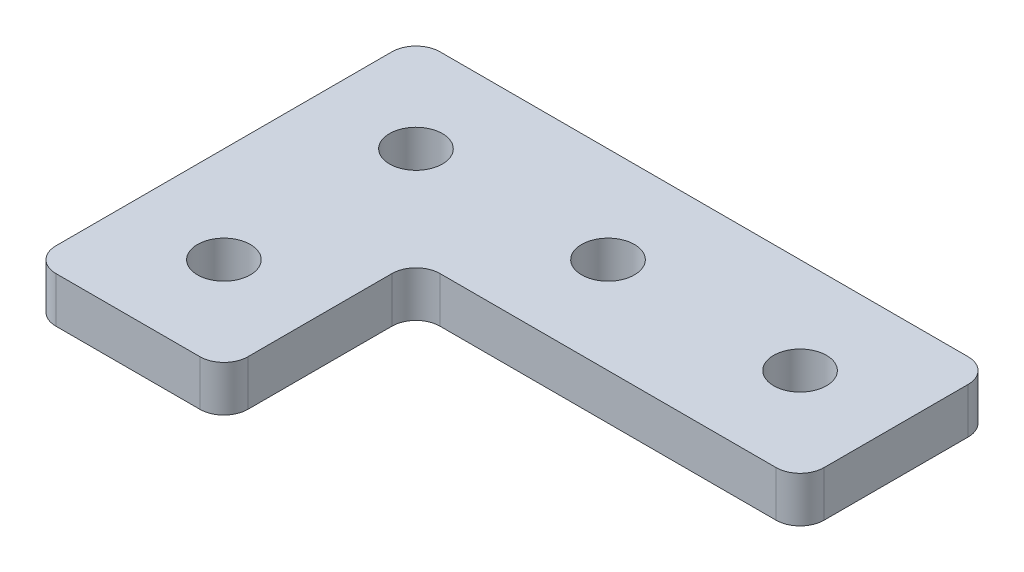
ISO-10303-21;
HEADER;
FILE_DESCRIPTION(('STEP AP214'),'2;1');
FILE_NAME('part.step','',(''),(''),'','','');
FILE_SCHEMA(('AUTOMOTIVE_DESIGN { 1 0 10303 214 1 1 1 1 }'));
ENDSEC;
DATA;
#1=APPLICATION_CONTEXT('core data for automotive mechanical design processes');
#2=APPLICATION_PROTOCOL_DEFINITION('international standard','automotive_design',2000,#1);
#3=PRODUCT_CONTEXT('',#1,'mechanical');
#4=PRODUCT('Part','Part','',(#3));
#5=PRODUCT_RELATED_PRODUCT_CATEGORY('part','',(#4));
#6=PRODUCT_DEFINITION_FORMATION('','',#4);
#7=PRODUCT_DEFINITION_CONTEXT('part definition',#1,'design');
#8=PRODUCT_DEFINITION('design','',#6,#7);
#9=PRODUCT_DEFINITION_SHAPE('','',#8);
#10=(LENGTH_UNIT() NAMED_UNIT(*) SI_UNIT(.MILLI.,.METRE.));
#11=(NAMED_UNIT(*) PLANE_ANGLE_UNIT() SI_UNIT($,.RADIAN.));
#12=(NAMED_UNIT(*) SI_UNIT($,.STERADIAN.) SOLID_ANGLE_UNIT());
#13=UNCERTAINTY_MEASURE_WITH_UNIT(LENGTH_MEASURE(1.E-05),#10,'distance_accuracy_value','');
#14=(GEOMETRIC_REPRESENTATION_CONTEXT(3) GLOBAL_UNCERTAINTY_ASSIGNED_CONTEXT((#13)) GLOBAL_UNIT_ASSIGNED_CONTEXT((#10,
#11,#12)) REPRESENTATION_CONTEXT('',''));
#15=CARTESIAN_POINT('',(0.,0.,0.));
#16=DIRECTION('',(0.,0.,1.));
#17=DIRECTION('',(1.,0.,0.));
#18=AXIS2_PLACEMENT_3D('',#15,#16,#17);
#19=CARTESIAN_POINT('',(47.5,2.3749,-7.50000000000001));
#20=DIRECTION('',(0.,1.,0.));
#21=DIRECTION('',(0.,0.,1.));
#22=AXIS2_PLACEMENT_3D('',#19,#20,#21);
#23=PLANE('',#22);
#24=CARTESIAN_POINT('',(40.,2.3749,0.));
#25=DIRECTION('',(0.,1.,0.));
#26=DIRECTION('',(0.,0.,1.));
#27=AXIS2_PLACEMENT_3D('',#24,#25,#26);
#28=CIRCLE('',#27,2.75);
#29=CARTESIAN_POINT('',(40.,2.3749,2.75));
#30=VERTEX_POINT('',#29);
#31=EDGE_CURVE('E225',#30,#30,#28,.T.);
#32=ORIENTED_EDGE('',*,*,#31,.F.);
#33=EDGE_LOOP('',(#32));
#34=FACE_BOUND('',#33,.T.);
#35=CARTESIAN_POINT('',(0.,2.3749,0.));
#36=DIRECTION('',(0.,1.,0.));
#37=DIRECTION('',(0.,0.,1.));
#38=AXIS2_PLACEMENT_3D('',#35,#36,#37);
#39=CIRCLE('',#38,2.75);
#40=CARTESIAN_POINT('',(0.,2.3749,2.75));
#41=VERTEX_POINT('',#40);
#42=EDGE_CURVE('E309',#41,#41,#39,.T.);
#43=ORIENTED_EDGE('',*,*,#42,.F.);
#44=EDGE_LOOP('',(#43));
#45=FACE_BOUND('',#44,.T.);
#46=CARTESIAN_POINT('',(47.5,2.3749,-7.50000000000001));
#47=DIRECTION('',(0.,1.,0.));
#48=DIRECTION('',(0.,0.,1.));
#49=AXIS2_PLACEMENT_3D('',#46,#47,#48);
#50=CIRCLE('',#49,2.5);
#51=CARTESIAN_POINT('',(50.,2.3749,-7.49999999999999));
#52=VERTEX_POINT('',#51);
#53=CARTESIAN_POINT('',(47.5,2.3749,-10.));
#54=VERTEX_POINT('',#53);
#55=EDGE_CURVE('E311',#52,#54,#50,.T.);
#56=ORIENTED_EDGE('',*,*,#55,.T.);
#57=DIRECTION('',(-1.,0.,0.));
#58=VECTOR('',#57,1.);
#59=CARTESIAN_POINT('',(47.5,2.3749,-10.));
#60=LINE('',#59,#58);
#61=CARTESIAN_POINT('',(-7.50000000000001,2.3749,-9.99999999999998));
#62=VERTEX_POINT('',#61);
#63=EDGE_CURVE('E134',#54,#62,#60,.T.);
#64=ORIENTED_EDGE('',*,*,#63,.T.);
#65=CARTESIAN_POINT('',(-7.50000000000001,2.3749,-7.49999999999998));
#66=DIRECTION('',(0.,1.,0.));
#67=DIRECTION('',(0.,0.,-1.));
#68=AXIS2_PLACEMENT_3D('',#65,#66,#67);
#69=CIRCLE('',#68,2.5);
#70=CARTESIAN_POINT('',(-10.,2.3749,-7.49999999999996));
#71=VERTEX_POINT('',#70);
#72=EDGE_CURVE('E359',#62,#71,#69,.T.);
#73=ORIENTED_EDGE('',*,*,#72,.T.);
#74=DIRECTION('',(0.,0.,1.));
#75=VECTOR('',#74,1.);
#76=CARTESIAN_POINT('',(-10.,2.3749,-7.49999999999996));
#77=LINE('',#76,#75);
#78=CARTESIAN_POINT('',(-10.,2.3749,27.5));
#79=VERTEX_POINT('',#78);
#80=EDGE_CURVE('E341',#71,#79,#77,.T.);
#81=ORIENTED_EDGE('',*,*,#80,.T.);
#82=CARTESIAN_POINT('',(-7.50000000000001,2.3749,27.5));
#83=DIRECTION('',(0.,1.,0.));
#84=DIRECTION('',(0.,0.,1.));
#85=AXIS2_PLACEMENT_3D('',#82,#83,#84);
#86=CIRCLE('',#85,2.5);
#87=CARTESIAN_POINT('',(-7.49999999999999,2.3749,30.));
#88=VERTEX_POINT('',#87);
#89=EDGE_CURVE('E335',#79,#88,#86,.T.);
#90=ORIENTED_EDGE('',*,*,#89,.T.);
#91=DIRECTION('',(1.,0.,0.));
#92=VECTOR('',#91,1.);
#93=CARTESIAN_POINT('',(-7.49999999999999,2.3749,30.));
#94=LINE('',#93,#92);
#95=CARTESIAN_POINT('',(7.49999999999998,2.3749,30.));
#96=VERTEX_POINT('',#95);
#97=EDGE_CURVE('E340',#88,#96,#94,.T.);
#98=ORIENTED_EDGE('',*,*,#97,.T.);
#99=CARTESIAN_POINT('',(7.49999999999999,2.3749,27.5));
#100=DIRECTION('',(0.,1.,0.));
#101=DIRECTION('',(0.,0.,1.));
#102=AXIS2_PLACEMENT_3D('',#99,#100,#101);
#103=CIRCLE('',#102,2.5);
#104=CARTESIAN_POINT('',(9.99999999999999,2.3749,27.5));
#105=VERTEX_POINT('',#104);
#106=EDGE_CURVE('E345',#96,#105,#103,.T.);
#107=ORIENTED_EDGE('',*,*,#106,.T.);
#108=DIRECTION('',(0.,0.,-1.));
#109=VECTOR('',#108,1.);
#110=CARTESIAN_POINT('',(9.99999999999999,2.3749,27.5));
#111=LINE('',#110,#109);
#112=CARTESIAN_POINT('',(10.,2.3749,12.5));
#113=VERTEX_POINT('',#112);
#114=EDGE_CURVE('E351',#105,#113,#111,.T.);
#115=ORIENTED_EDGE('',*,*,#114,.T.);
#116=CARTESIAN_POINT('',(12.5,2.3749,12.5));
#117=DIRECTION('',(0.,-1.,0.));
#118=DIRECTION('',(0.,0.,-1.));
#119=AXIS2_PLACEMENT_3D('',#116,#117,#118);
#120=CIRCLE('',#119,2.5);
#121=CARTESIAN_POINT('',(12.5,2.3749,10.));
#122=VERTEX_POINT('',#121);
#123=EDGE_CURVE('E174',#113,#122,#120,.T.);
#124=ORIENTED_EDGE('',*,*,#123,.T.);
#125=DIRECTION('',(1.,0.,0.));
#126=VECTOR('',#125,1.);
#127=CARTESIAN_POINT('',(12.5,2.3749,10.));
#128=LINE('',#127,#126);
#129=CARTESIAN_POINT('',(47.5,2.3749,9.99999999999999));
#130=VERTEX_POINT('',#129);
#131=EDGE_CURVE('E168',#122,#130,#128,.T.);
#132=ORIENTED_EDGE('',*,*,#131,.T.);
#133=CARTESIAN_POINT('',(47.5,2.3749,7.49999999999999));
#134=DIRECTION('',(0.,1.,0.));
#135=DIRECTION('',(0.,0.,1.));
#136=AXIS2_PLACEMENT_3D('',#133,#134,#135);
#137=CIRCLE('',#136,2.5);
#138=CARTESIAN_POINT('',(50.,2.3749,7.49999999999997));
#139=VERTEX_POINT('',#138);
#140=EDGE_CURVE('E172',#130,#139,#137,.T.);
#141=ORIENTED_EDGE('',*,*,#140,.T.);
#142=DIRECTION('',(0.,0.,-1.));
#143=VECTOR('',#142,1.);
#144=CARTESIAN_POINT('',(50.,2.3749,7.49999999999997));
#145=LINE('',#144,#143);
#146=EDGE_CURVE('E67',#139,#52,#145,.T.);
#147=ORIENTED_EDGE('',*,*,#146,.T.);
#148=EDGE_LOOP('',(#56,#64,#73,#81,#90,#98,#107,#115,#124,#132,#141,#147));
#149=FACE_BOUND('',#148,.T.);
#150=CARTESIAN_POINT('',(20.,2.3749,0.));
#151=DIRECTION('',(0.,1.,0.));
#152=DIRECTION('',(0.,0.,1.));
#153=AXIS2_PLACEMENT_3D('',#150,#151,#152);
#154=CIRCLE('',#153,2.75);
#155=CARTESIAN_POINT('',(20.,2.3749,2.75));
#156=VERTEX_POINT('',#155);
#157=EDGE_CURVE('E241',#156,#156,#154,.T.);
#158=ORIENTED_EDGE('',*,*,#157,.F.);
#159=EDGE_LOOP('',(#158));
#160=FACE_BOUND('',#159,.T.);
#161=CARTESIAN_POINT('',(0.,2.3749,20.));
#162=DIRECTION('',(0.,1.,0.));
#163=DIRECTION('',(0.,0.,1.));
#164=AXIS2_PLACEMENT_3D('',#161,#162,#163);
#165=CIRCLE('',#164,2.75);
#166=CARTESIAN_POINT('',(0.,2.3749,22.75));
#167=VERTEX_POINT('',#166);
#168=EDGE_CURVE('E240',#167,#167,#165,.T.);
#169=ORIENTED_EDGE('',*,*,#168,.F.);
#170=EDGE_LOOP('',(#169));
#171=FACE_BOUND('',#170,.T.);
#172=ADVANCED_FACE('F44',(#34,#45,#149,#160,#171),#23,.T.);
#173=CARTESIAN_POINT('',(47.5,-2.3749,-7.50000000000001));
#174=DIRECTION('',(0.,1.,0.));
#175=DIRECTION('',(0.,0.,1.));
#176=AXIS2_PLACEMENT_3D('',#173,#174,#175);
#177=PLANE('',#176);
#178=CARTESIAN_POINT('',(47.5,-2.3749,-7.50000000000001));
#179=DIRECTION('',(0.,1.,0.));
#180=DIRECTION('',(0.,0.,1.));
#181=AXIS2_PLACEMENT_3D('',#178,#179,#180);
#182=CIRCLE('',#181,2.5);
#183=CARTESIAN_POINT('',(50.,-2.3749,-7.49999999999999));
#184=VERTEX_POINT('',#183);
#185=CARTESIAN_POINT('',(47.5,-2.3749,-10.));
#186=VERTEX_POINT('',#185);
#187=EDGE_CURVE('E290',#184,#186,#182,.T.);
#188=ORIENTED_EDGE('',*,*,#187,.F.);
#189=DIRECTION('',(0.,0.,-1.));
#190=VECTOR('',#189,1.);
#191=CARTESIAN_POINT('',(50.,-2.3749,7.49999999999997));
#192=LINE('',#191,#190);
#193=CARTESIAN_POINT('',(50.,-2.3749,7.49999999999997));
#194=VERTEX_POINT('',#193);
#195=EDGE_CURVE('E126',#194,#184,#192,.T.);
#196=ORIENTED_EDGE('',*,*,#195,.F.);
#197=CARTESIAN_POINT('',(47.5,-2.3749,7.49999999999999));
#198=DIRECTION('',(0.,1.,0.));
#199=DIRECTION('',(0.,0.,1.));
#200=AXIS2_PLACEMENT_3D('',#197,#198,#199);
#201=CIRCLE('',#200,2.5);
#202=CARTESIAN_POINT('',(47.5,-2.3749,9.99999999999999));
#203=VERTEX_POINT('',#202);
#204=EDGE_CURVE('E119',#203,#194,#201,.T.);
#205=ORIENTED_EDGE('',*,*,#204,.F.);
#206=DIRECTION('',(1.,0.,0.));
#207=VECTOR('',#206,1.);
#208=CARTESIAN_POINT('',(12.5,-2.3749,10.));
#209=LINE('',#208,#207);
#210=CARTESIAN_POINT('',(12.5,-2.3749,10.));
#211=VERTEX_POINT('',#210);
#212=EDGE_CURVE('E183',#211,#203,#209,.T.);
#213=ORIENTED_EDGE('',*,*,#212,.F.);
#214=CARTESIAN_POINT('',(12.5,-2.3749,12.5));
#215=DIRECTION('',(0.,-1.,0.));
#216=DIRECTION('',(0.,0.,-1.));
#217=AXIS2_PLACEMENT_3D('',#214,#215,#216);
#218=CIRCLE('',#217,2.5);
#219=CARTESIAN_POINT('',(10.,-2.3749,12.5));
#220=VERTEX_POINT('',#219);
#221=EDGE_CURVE('E465',#220,#211,#218,.T.);
#222=ORIENTED_EDGE('',*,*,#221,.F.);
#223=DIRECTION('',(0.,0.,-1.));
#224=VECTOR('',#223,1.);
#225=CARTESIAN_POINT('',(9.99999999999999,-2.3749,27.5));
#226=LINE('',#225,#224);
#227=CARTESIAN_POINT('',(9.99999999999999,-2.3749,27.5));
#228=VERTEX_POINT('',#227);
#229=EDGE_CURVE('E260',#228,#220,#226,.T.);
#230=ORIENTED_EDGE('',*,*,#229,.F.);
#231=CARTESIAN_POINT('',(7.49999999999999,-2.3749,27.5));
#232=DIRECTION('',(0.,1.,0.));
#233=DIRECTION('',(0.,0.,1.));
#234=AXIS2_PLACEMENT_3D('',#231,#232,#233);
#235=CIRCLE('',#234,2.5);
#236=CARTESIAN_POINT('',(7.49999999999998,-2.3749,30.));
#237=VERTEX_POINT('',#236);
#238=EDGE_CURVE('E253',#237,#228,#235,.T.);
#239=ORIENTED_EDGE('',*,*,#238,.F.);
#240=DIRECTION('',(1.,0.,0.));
#241=VECTOR('',#240,1.);
#242=CARTESIAN_POINT('',(-7.49999999999999,-2.3749,30.));
#243=LINE('',#242,#241);
#244=CARTESIAN_POINT('',(-7.49999999999999,-2.3749,30.));
#245=VERTEX_POINT('',#244);
#246=EDGE_CURVE('E248',#245,#237,#243,.T.);
#247=ORIENTED_EDGE('',*,*,#246,.F.);
#248=CARTESIAN_POINT('',(-7.50000000000001,-2.3749,27.5));
#249=DIRECTION('',(0.,1.,0.));
#250=DIRECTION('',(0.,0.,1.));
#251=AXIS2_PLACEMENT_3D('',#248,#249,#250);
#252=CIRCLE('',#251,2.5);
#253=CARTESIAN_POINT('',(-10.,-2.3749,27.5));
#254=VERTEX_POINT('',#253);
#255=EDGE_CURVE('E254',#254,#245,#252,.T.);
#256=ORIENTED_EDGE('',*,*,#255,.F.);
#257=DIRECTION('',(0.,0.,1.));
#258=VECTOR('',#257,1.);
#259=CARTESIAN_POINT('',(-10.,-2.3749,-7.49999999999996));
#260=LINE('',#259,#258);
#261=CARTESIAN_POINT('',(-10.,-2.3749,-7.49999999999996));
#262=VERTEX_POINT('',#261);
#263=EDGE_CURVE('E294',#262,#254,#260,.T.);
#264=ORIENTED_EDGE('',*,*,#263,.F.);
#265=CARTESIAN_POINT('',(-7.50000000000001,-2.3749,-7.49999999999998));
#266=DIRECTION('',(0.,1.,0.));
#267=DIRECTION('',(0.,0.,-1.));
#268=AXIS2_PLACEMENT_3D('',#265,#266,#267);
#269=CIRCLE('',#268,2.5);
#270=CARTESIAN_POINT('',(-7.50000000000001,-2.3749,-9.99999999999998));
#271=VERTEX_POINT('',#270);
#272=EDGE_CURVE('E289',#271,#262,#269,.T.);
#273=ORIENTED_EDGE('',*,*,#272,.F.);
#274=DIRECTION('',(-1.,0.,0.));
#275=VECTOR('',#274,1.);
#276=CARTESIAN_POINT('',(47.5,-2.3749,-10.));
#277=LINE('',#276,#275);
#278=EDGE_CURVE('E286',#186,#271,#277,.T.);
#279=ORIENTED_EDGE('',*,*,#278,.F.);
#280=EDGE_LOOP('',(#188,#196,#205,#213,#222,#230,#239,#247,#256,#264,#273,#279));
#281=FACE_BOUND('',#280,.T.);
#282=CARTESIAN_POINT('',(0.,-2.3749,0.));
#283=DIRECTION('',(0.,1.,0.));
#284=DIRECTION('',(0.,0.,1.));
#285=AXIS2_PLACEMENT_3D('',#282,#283,#284);
#286=CIRCLE('',#285,2.75);
#287=CARTESIAN_POINT('',(0.,-2.3749,2.75));
#288=VERTEX_POINT('',#287);
#289=EDGE_CURVE('E304',#288,#288,#286,.T.);
#290=ORIENTED_EDGE('',*,*,#289,.T.);
#291=EDGE_LOOP('',(#290));
#292=FACE_BOUND('',#291,.T.);
#293=CARTESIAN_POINT('',(20.,-2.3749,0.));
#294=DIRECTION('',(0.,1.,0.));
#295=DIRECTION('',(0.,0.,1.));
#296=AXIS2_PLACEMENT_3D('',#293,#294,#295);
#297=CIRCLE('',#296,2.75);
#298=CARTESIAN_POINT('',(20.,-2.3749,2.75));
#299=VERTEX_POINT('',#298);
#300=EDGE_CURVE('E231',#299,#299,#297,.T.);
#301=ORIENTED_EDGE('',*,*,#300,.T.);
#302=EDGE_LOOP('',(#301));
#303=FACE_BOUND('',#302,.T.);
#304=CARTESIAN_POINT('',(40.,-2.3749,0.));
#305=DIRECTION('',(0.,1.,0.));
#306=DIRECTION('',(0.,0.,1.));
#307=AXIS2_PLACEMENT_3D('',#304,#305,#306);
#308=CIRCLE('',#307,2.75);
#309=CARTESIAN_POINT('',(40.,-2.3749,2.75));
#310=VERTEX_POINT('',#309);
#311=EDGE_CURVE('E232',#310,#310,#308,.T.);
#312=ORIENTED_EDGE('',*,*,#311,.T.);
#313=EDGE_LOOP('',(#312));
#314=FACE_BOUND('',#313,.T.);
#315=CARTESIAN_POINT('',(0.,-2.3749,20.));
#316=DIRECTION('',(0.,1.,0.));
#317=DIRECTION('',(0.,0.,1.));
#318=AXIS2_PLACEMENT_3D('',#315,#316,#317);
#319=CIRCLE('',#318,2.75);
#320=CARTESIAN_POINT('',(0.,-2.3749,22.75));
#321=VERTEX_POINT('',#320);
#322=EDGE_CURVE('E233',#321,#321,#319,.T.);
#323=ORIENTED_EDGE('',*,*,#322,.T.);
#324=EDGE_LOOP('',(#323));
#325=FACE_BOUND('',#324,.T.);
#326=ADVANCED_FACE('F372',(#281,#292,#303,#314,#325),#177,.F.);
#327=CARTESIAN_POINT('',(47.5,2.3749,-7.50000000000001));
#328=DIRECTION('',(0.,-1.,0.));
#329=DIRECTION('',(0.,0.,-1.));
#330=AXIS2_PLACEMENT_3D('',#327,#328,#329);
#331=CYLINDRICAL_SURFACE('',#330,2.5);
#332=ORIENTED_EDGE('',*,*,#187,.T.);
#333=DIRECTION('',(0.,-1.,0.));
#334=VECTOR('',#333,1.);
#335=CARTESIAN_POINT('',(47.5,2.3749,-10.));
#336=LINE('',#335,#334);
#337=EDGE_CURVE('E12',#54,#186,#336,.T.);
#338=ORIENTED_EDGE('',*,*,#337,.F.);
#339=ORIENTED_EDGE('',*,*,#55,.F.);
#340=DIRECTION('',(0.,-1.,0.));
#341=VECTOR('',#340,1.);
#342=CARTESIAN_POINT('',(50.,2.3749,-7.49999999999999));
#343=LINE('',#342,#341);
#344=EDGE_CURVE('E192',#52,#184,#343,.T.);
#345=ORIENTED_EDGE('',*,*,#344,.T.);
#346=EDGE_LOOP('',(#332,#338,#339,#345));
#347=FACE_BOUND('',#346,.T.);
#348=ADVANCED_FACE('F47',(#347),#331,.T.);
#349=CARTESIAN_POINT('',(47.5,2.3749,-10.));
#350=DIRECTION('',(0.,0.,1.));
#351=DIRECTION('',(1.,0.,0.));
#352=AXIS2_PLACEMENT_3D('',#349,#350,#351);
#353=PLANE('',#352);
#354=ORIENTED_EDGE('',*,*,#278,.T.);
#355=DIRECTION('',(0.,-1.,0.));
#356=VECTOR('',#355,1.);
#357=CARTESIAN_POINT('',(-7.50000000000001,2.3749,-9.99999999999998));
#358=LINE('',#357,#356);
#359=EDGE_CURVE('E56',#62,#271,#358,.T.);
#360=ORIENTED_EDGE('',*,*,#359,.F.);
#361=ORIENTED_EDGE('',*,*,#63,.F.);
#362=ORIENTED_EDGE('',*,*,#337,.T.);
#363=EDGE_LOOP('',(#354,#360,#361,#362));
#364=FACE_BOUND('',#363,.T.);
#365=ADVANCED_FACE('F377',(#364),#353,.F.);
#366=CARTESIAN_POINT('',(-7.50000000000001,2.3749,-7.49999999999998));
#367=DIRECTION('',(0.,-1.,0.));
#368=DIRECTION('',(0.,0.,-1.));
#369=AXIS2_PLACEMENT_3D('',#366,#367,#368);
#370=CYLINDRICAL_SURFACE('',#369,2.5);
#371=ORIENTED_EDGE('',*,*,#272,.T.);
#372=DIRECTION('',(0.,-1.,0.));
#373=VECTOR('',#372,1.);
#374=CARTESIAN_POINT('',(-10.,2.3749,-7.49999999999996));
#375=LINE('',#374,#373);
#376=EDGE_CURVE('E454',#71,#262,#375,.T.);
#377=ORIENTED_EDGE('',*,*,#376,.F.);
#378=ORIENTED_EDGE('',*,*,#72,.F.);
#379=ORIENTED_EDGE('',*,*,#359,.T.);
#380=EDGE_LOOP('',(#371,#377,#378,#379));
#381=FACE_BOUND('',#380,.T.);
#382=ADVANCED_FACE('F379',(#381),#370,.T.);
#383=CARTESIAN_POINT('',(-10.,2.3749,-7.49999999999996));
#384=DIRECTION('',(1.,0.,0.));
#385=DIRECTION('',(0.,0.,-1.));
#386=AXIS2_PLACEMENT_3D('',#383,#384,#385);
#387=PLANE('',#386);
#388=ORIENTED_EDGE('',*,*,#263,.T.);
#389=DIRECTION('',(0.,-1.,0.));
#390=VECTOR('',#389,1.);
#391=CARTESIAN_POINT('',(-10.,2.3749,27.5));
#392=LINE('',#391,#390);
#393=EDGE_CURVE('E451',#79,#254,#392,.T.);
#394=ORIENTED_EDGE('',*,*,#393,.F.);
#395=ORIENTED_EDGE('',*,*,#80,.F.);
#396=ORIENTED_EDGE('',*,*,#376,.T.);
#397=EDGE_LOOP('',(#388,#394,#395,#396));
#398=FACE_BOUND('',#397,.T.);
#399=ADVANCED_FACE('F384',(#398),#387,.F.);
#400=CARTESIAN_POINT('',(-7.50000000000001,2.3749,27.5));
#401=DIRECTION('',(0.,-1.,0.));
#402=DIRECTION('',(0.,0.,-1.));
#403=AXIS2_PLACEMENT_3D('',#400,#401,#402);
#404=CYLINDRICAL_SURFACE('',#403,2.5);
#405=ORIENTED_EDGE('',*,*,#255,.T.);
#406=DIRECTION('',(0.,-1.,0.));
#407=VECTOR('',#406,1.);
#408=CARTESIAN_POINT('',(-7.49999999999999,2.3749,30.));
#409=LINE('',#408,#407);
#410=EDGE_CURVE('E280',#88,#245,#409,.T.);
#411=ORIENTED_EDGE('',*,*,#410,.F.);
#412=ORIENTED_EDGE('',*,*,#89,.F.);
#413=ORIENTED_EDGE('',*,*,#393,.T.);
#414=EDGE_LOOP('',(#405,#411,#412,#413));
#415=FACE_BOUND('',#414,.T.);
#416=ADVANCED_FACE('F438',(#415),#404,.T.);
#417=CARTESIAN_POINT('',(-7.49999999999999,2.3749,30.));
#418=DIRECTION('',(0.,0.,-1.));
#419=DIRECTION('',(-1.,0.,0.));
#420=AXIS2_PLACEMENT_3D('',#417,#418,#419);
#421=PLANE('',#420);
#422=ORIENTED_EDGE('',*,*,#246,.T.);
#423=DIRECTION('',(0.,-1.,0.));
#424=VECTOR('',#423,1.);
#425=CARTESIAN_POINT('',(7.49999999999998,2.3749,30.));
#426=LINE('',#425,#424);
#427=EDGE_CURVE('E275',#96,#237,#426,.T.);
#428=ORIENTED_EDGE('',*,*,#427,.F.);
#429=ORIENTED_EDGE('',*,*,#97,.F.);
#430=ORIENTED_EDGE('',*,*,#410,.T.);
#431=EDGE_LOOP('',(#422,#428,#429,#430));
#432=FACE_BOUND('',#431,.T.);
#433=ADVANCED_FACE('F433',(#432),#421,.F.);
#434=CARTESIAN_POINT('',(7.49999999999999,2.3749,27.5));
#435=DIRECTION('',(0.,-1.,0.));
#436=DIRECTION('',(0.,0.,-1.));
#437=AXIS2_PLACEMENT_3D('',#434,#435,#436);
#438=CYLINDRICAL_SURFACE('',#437,2.5);
#439=ORIENTED_EDGE('',*,*,#238,.T.);
#440=DIRECTION('',(0.,-1.,0.));
#441=VECTOR('',#440,1.);
#442=CARTESIAN_POINT('',(9.99999999999999,2.3749,27.5));
#443=LINE('',#442,#441);
#444=EDGE_CURVE('E270',#105,#228,#443,.T.);
#445=ORIENTED_EDGE('',*,*,#444,.F.);
#446=ORIENTED_EDGE('',*,*,#106,.F.);
#447=ORIENTED_EDGE('',*,*,#427,.T.);
#448=EDGE_LOOP('',(#439,#445,#446,#447));
#449=FACE_BOUND('',#448,.T.);
#450=ADVANCED_FACE('F428',(#449),#438,.T.);
#451=CARTESIAN_POINT('',(9.99999999999999,2.3749,27.5));
#452=DIRECTION('',(-1.,0.,0.));
#453=DIRECTION('',(0.,0.,1.));
#454=AXIS2_PLACEMENT_3D('',#451,#452,#453);
#455=PLANE('',#454);
#456=ORIENTED_EDGE('',*,*,#229,.T.);
#457=DIRECTION('',(0.,-1.,0.));
#458=VECTOR('',#457,1.);
#459=CARTESIAN_POINT('',(10.,2.3749,12.5));
#460=LINE('',#459,#458);
#461=EDGE_CURVE('E214',#113,#220,#460,.T.);
#462=ORIENTED_EDGE('',*,*,#461,.F.);
#463=ORIENTED_EDGE('',*,*,#114,.F.);
#464=ORIENTED_EDGE('',*,*,#444,.T.);
#465=EDGE_LOOP('',(#456,#462,#463,#464));
#466=FACE_BOUND('',#465,.T.);
#467=ADVANCED_FACE('F422',(#466),#455,.F.);
#468=CARTESIAN_POINT('',(12.5,2.3749,12.5));
#469=DIRECTION('',(0.,-1.,0.));
#470=DIRECTION('',(0.,0.,-1.));
#471=AXIS2_PLACEMENT_3D('',#468,#469,#470);
#472=CYLINDRICAL_SURFACE('',#471,2.5);
#473=ORIENTED_EDGE('',*,*,#221,.T.);
#474=DIRECTION('',(0.,-1.,0.));
#475=VECTOR('',#474,1.);
#476=CARTESIAN_POINT('',(12.5,2.3749,10.));
#477=LINE('',#476,#475);
#478=EDGE_CURVE('E185',#122,#211,#477,.T.);
#479=ORIENTED_EDGE('',*,*,#478,.F.);
#480=ORIENTED_EDGE('',*,*,#123,.F.);
#481=ORIENTED_EDGE('',*,*,#461,.T.);
#482=EDGE_LOOP('',(#473,#479,#480,#481));
#483=FACE_BOUND('',#482,.T.);
#484=ADVANCED_FACE('F418',(#483),#472,.F.);
#485=CARTESIAN_POINT('',(12.5,2.3749,10.));
#486=DIRECTION('',(0.,0.,-1.));
#487=DIRECTION('',(-1.,0.,0.));
#488=AXIS2_PLACEMENT_3D('',#485,#486,#487);
#489=PLANE('',#488);
#490=ORIENTED_EDGE('',*,*,#212,.T.);
#491=DIRECTION('',(0.,-1.,0.));
#492=VECTOR('',#491,1.);
#493=CARTESIAN_POINT('',(47.5,2.3749,9.99999999999999));
#494=LINE('',#493,#492);
#495=EDGE_CURVE('E180',#130,#203,#494,.T.);
#496=ORIENTED_EDGE('',*,*,#495,.F.);
#497=ORIENTED_EDGE('',*,*,#131,.F.);
#498=ORIENTED_EDGE('',*,*,#478,.T.);
#499=EDGE_LOOP('',(#490,#496,#497,#498));
#500=FACE_BOUND('',#499,.T.);
#501=ADVANCED_FACE('F181',(#500),#489,.F.);
#502=CARTESIAN_POINT('',(47.5,2.3749,7.49999999999999));
#503=DIRECTION('',(0.,-1.,0.));
#504=DIRECTION('',(0.,0.,-1.));
#505=AXIS2_PLACEMENT_3D('',#502,#503,#504);
#506=CYLINDRICAL_SURFACE('',#505,2.5);
#507=ORIENTED_EDGE('',*,*,#204,.T.);
#508=DIRECTION('',(0.,-1.,0.));
#509=VECTOR('',#508,1.);
#510=CARTESIAN_POINT('',(50.,2.3749,7.49999999999997));
#511=LINE('',#510,#509);
#512=EDGE_CURVE('E186',#139,#194,#511,.T.);
#513=ORIENTED_EDGE('',*,*,#512,.F.);
#514=ORIENTED_EDGE('',*,*,#140,.F.);
#515=ORIENTED_EDGE('',*,*,#495,.T.);
#516=EDGE_LOOP('',(#507,#513,#514,#515));
#517=FACE_BOUND('',#516,.T.);
#518=ADVANCED_FACE('F188',(#517),#506,.T.);
#519=CARTESIAN_POINT('',(50.,2.3749,7.49999999999997));
#520=DIRECTION('',(-1.,0.,0.));
#521=DIRECTION('',(0.,0.,1.));
#522=AXIS2_PLACEMENT_3D('',#519,#520,#521);
#523=PLANE('',#522);
#524=ORIENTED_EDGE('',*,*,#195,.T.);
#525=ORIENTED_EDGE('',*,*,#344,.F.);
#526=ORIENTED_EDGE('',*,*,#146,.F.);
#527=ORIENTED_EDGE('',*,*,#512,.T.);
#528=EDGE_LOOP('',(#524,#525,#526,#527));
#529=FACE_BOUND('',#528,.T.);
#530=ADVANCED_FACE('F408',(#529),#523,.F.);
#531=CARTESIAN_POINT('',(0.,2.3749,0.));
#532=DIRECTION('',(0.,-1.,0.));
#533=DIRECTION('',(0.,0.,-1.));
#534=AXIS2_PLACEMENT_3D('',#531,#532,#533);
#535=CYLINDRICAL_SURFACE('',#534,2.75);
#536=ORIENTED_EDGE('',*,*,#42,.T.);
#537=EDGE_LOOP('',(#536));
#538=FACE_BOUND('',#537,.T.);
#539=ORIENTED_EDGE('',*,*,#289,.F.);
#540=EDGE_LOOP('',(#539));
#541=FACE_BOUND('',#540,.T.);
#542=ADVANCED_FACE('F402',(#538,#541),#535,.F.);
#543=CARTESIAN_POINT('',(20.,2.3749,0.));
#544=DIRECTION('',(0.,-1.,0.));
#545=DIRECTION('',(0.,0.,-1.));
#546=AXIS2_PLACEMENT_3D('',#543,#544,#545);
#547=CYLINDRICAL_SURFACE('',#546,2.75);
#548=ORIENTED_EDGE('',*,*,#157,.T.);
#549=EDGE_LOOP('',(#548));
#550=FACE_BOUND('',#549,.T.);
#551=ORIENTED_EDGE('',*,*,#300,.F.);
#552=EDGE_LOOP('',(#551));
#553=FACE_BOUND('',#552,.T.);
#554=ADVANCED_FACE('F492',(#550,#553),#547,.F.);
#555=CARTESIAN_POINT('',(40.,2.3749,0.));
#556=DIRECTION('',(0.,-1.,0.));
#557=DIRECTION('',(0.,0.,-1.));
#558=AXIS2_PLACEMENT_3D('',#555,#556,#557);
#559=CYLINDRICAL_SURFACE('',#558,2.75);
#560=ORIENTED_EDGE('',*,*,#31,.T.);
#561=EDGE_LOOP('',(#560));
#562=FACE_BOUND('',#561,.T.);
#563=ORIENTED_EDGE('',*,*,#311,.F.);
#564=EDGE_LOOP('',(#563));
#565=FACE_BOUND('',#564,.T.);
#566=ADVANCED_FACE('F487',(#562,#565),#559,.F.);
#567=CARTESIAN_POINT('',(0.,2.3749,20.));
#568=DIRECTION('',(0.,-1.,0.));
#569=DIRECTION('',(0.,0.,-1.));
#570=AXIS2_PLACEMENT_3D('',#567,#568,#569);
#571=CYLINDRICAL_SURFACE('',#570,2.75);
#572=ORIENTED_EDGE('',*,*,#168,.T.);
#573=EDGE_LOOP('',(#572));
#574=FACE_BOUND('',#573,.T.);
#575=ORIENTED_EDGE('',*,*,#322,.F.);
#576=EDGE_LOOP('',(#575));
#577=FACE_BOUND('',#576,.T.);
#578=ADVANCED_FACE('F483',(#574,#577),#571,.F.);
#579=CLOSED_SHELL('',(#172,#326,#348,#365,#382,#399,#416,#433,#450,#467,#484,#501,#518,#530,
#542,#554,#566,#578));
#580=MANIFOLD_SOLID_BREP('B2',#579);
#581=ADVANCED_BREP_SHAPE_REPRESENTATION('',(#18,#580),#14);
#582=SHAPE_DEFINITION_REPRESENTATION(#9,#581);
ENDSEC;
END-ISO-10303-21;
